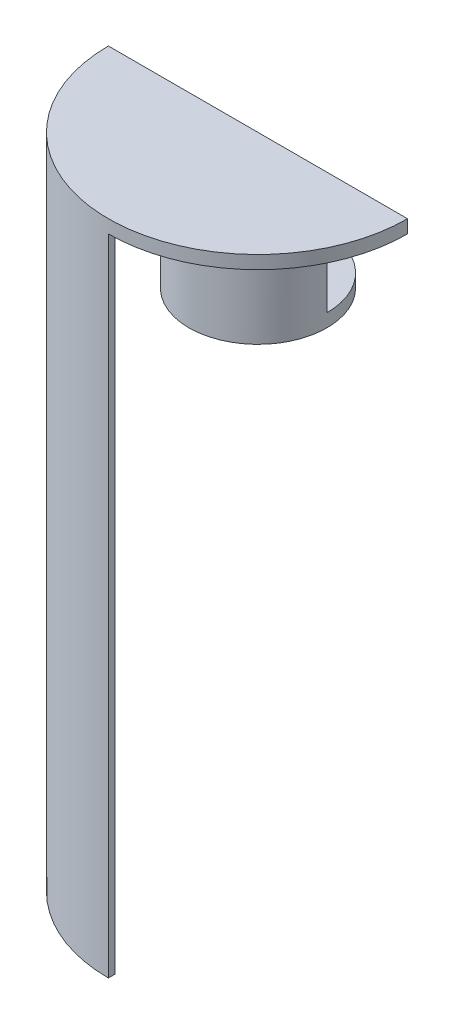
ISO-10303-21;
HEADER;
FILE_DESCRIPTION(('STEP AP214'),'2;1');
FILE_NAME('part.step','',(''),(''),'','','');
FILE_SCHEMA(('AUTOMOTIVE_DESIGN { 1 0 10303 214 1 1 1 1 }'));
ENDSEC;
DATA;
#1=APPLICATION_CONTEXT('core data for automotive mechanical design processes');
#2=APPLICATION_PROTOCOL_DEFINITION('international standard','automotive_design',2000,#1);
#3=PRODUCT_CONTEXT('',#1,'mechanical');
#4=PRODUCT('Part','Part','',(#3));
#5=PRODUCT_RELATED_PRODUCT_CATEGORY('part','',(#4));
#6=PRODUCT_DEFINITION_FORMATION('','',#4);
#7=PRODUCT_DEFINITION_CONTEXT('part definition',#1,'design');
#8=PRODUCT_DEFINITION('design','',#6,#7);
#9=PRODUCT_DEFINITION_SHAPE('','',#8);
#10=(LENGTH_UNIT() NAMED_UNIT(*) SI_UNIT(.MILLI.,.METRE.));
#11=(NAMED_UNIT(*) PLANE_ANGLE_UNIT() SI_UNIT($,.RADIAN.));
#12=(NAMED_UNIT(*) SI_UNIT($,.STERADIAN.) SOLID_ANGLE_UNIT());
#13=UNCERTAINTY_MEASURE_WITH_UNIT(LENGTH_MEASURE(1.E-05),#10,'distance_accuracy_value','');
#14=(GEOMETRIC_REPRESENTATION_CONTEXT(3) GLOBAL_UNCERTAINTY_ASSIGNED_CONTEXT((#13)) GLOBAL_UNIT_ASSIGNED_CONTEXT((#10,
#11,#12)) REPRESENTATION_CONTEXT('',''));
#15=CARTESIAN_POINT('',(0.,0.,0.));
#16=DIRECTION('',(0.,0.,1.));
#17=DIRECTION('',(1.,0.,0.));
#18=AXIS2_PLACEMENT_3D('',#15,#16,#17);
#19=CARTESIAN_POINT('',(0.,200.,0.));
#20=DIRECTION('',(0.,1.,0.));
#21=DIRECTION('',(0.,0.,1.));
#22=AXIS2_PLACEMENT_3D('',#19,#20,#21);
#23=PLANE('',#22);
#24=CARTESIAN_POINT('',(0.,200.,0.));
#25=DIRECTION('',(0.,-1.,0.));
#26=DIRECTION('',(0.,0.,1.));
#27=AXIS2_PLACEMENT_3D('',#24,#25,#26);
#28=CIRCLE('',#27,43.5);
#29=CARTESIAN_POINT('',(0.,200.,43.5));
#30=VERTEX_POINT('',#29);
#31=CARTESIAN_POINT('',(-43.5,200.,0.));
#32=VERTEX_POINT('',#31);
#33=EDGE_CURVE('E145',#30,#32,#28,.T.);
#34=ORIENTED_EDGE('',*,*,#33,.T.);
#35=DIRECTION('',(-1.,0.,0.));
#36=VECTOR('',#35,1.);
#37=CARTESIAN_POINT('',(0.,200.,0.));
#38=LINE('',#37,#36);
#39=CARTESIAN_POINT('',(-21.,200.,0.));
#40=VERTEX_POINT('',#39);
#41=EDGE_CURVE('E233',#40,#32,#38,.T.);
#42=ORIENTED_EDGE('',*,*,#41,.F.);
#43=CARTESIAN_POINT('',(0.,200.,0.));
#44=DIRECTION('',(0.,1.,0.));
#45=DIRECTION('',(0.,0.,1.));
#46=AXIS2_PLACEMENT_3D('',#43,#44,#45);
#47=CIRCLE('',#46,21.);
#48=CARTESIAN_POINT('',(21.,200.,0.));
#49=VERTEX_POINT('',#48);
#50=EDGE_CURVE('E170',#49,#40,#47,.F.);
#51=ORIENTED_EDGE('',*,*,#50,.F.);
#52=CARTESIAN_POINT('',(45.5,200.,0.));
#53=VERTEX_POINT('',#52);
#54=EDGE_CURVE('E152',#53,#49,#38,.T.);
#55=ORIENTED_EDGE('',*,*,#54,.F.);
#56=CARTESIAN_POINT('',(0.,200.,0.));
#57=DIRECTION('',(0.,1.,0.));
#58=DIRECTION('',(0.,0.,1.));
#59=AXIS2_PLACEMENT_3D('',#56,#57,#58);
#60=CIRCLE('',#59,45.5);
#61=CARTESIAN_POINT('',(0.,200.,45.5));
#62=VERTEX_POINT('',#61);
#63=EDGE_CURVE('E156',#62,#53,#60,.T.);
#64=ORIENTED_EDGE('',*,*,#63,.F.);
#65=DIRECTION('',(0.,0.,1.));
#66=VECTOR('',#65,1.);
#67=CARTESIAN_POINT('',(0.,200.,43.5));
#68=LINE('',#67,#66);
#69=EDGE_CURVE('E178',#30,#62,#68,.T.);
#70=ORIENTED_EDGE('',*,*,#69,.F.);
#71=EDGE_LOOP('',(#34,#42,#51,#55,#64,#70));
#72=FACE_BOUND('',#71,.T.);
#73=ADVANCED_FACE('F38',(#72),#23,.F.);
#74=CARTESIAN_POINT('',(0.,200.,0.));
#75=DIRECTION('',(0.,-1.,0.));
#76=DIRECTION('',(0.,0.,-1.));
#77=AXIS2_PLACEMENT_3D('',#74,#75,#76);
#78=CYLINDRICAL_SURFACE('',#77,45.5);
#79=CARTESIAN_POINT('',(0.,204.,0.));
#80=DIRECTION('',(0.,1.,0.));
#81=DIRECTION('',(0.,0.,1.));
#82=AXIS2_PLACEMENT_3D('',#79,#80,#81);
#83=CIRCLE('',#82,45.5);
#84=CARTESIAN_POINT('',(-45.5,204.,0.));
#85=VERTEX_POINT('',#84);
#86=CARTESIAN_POINT('',(45.5,204.,0.));
#87=VERTEX_POINT('',#86);
#88=EDGE_CURVE('E150',#85,#87,#83,.T.);
#89=ORIENTED_EDGE('',*,*,#88,.F.);
#90=DIRECTION('',(0.,-1.,0.));
#91=VECTOR('',#90,1.);
#92=CARTESIAN_POINT('',(-45.5,200.,0.));
#93=LINE('',#92,#91);
#94=CARTESIAN_POINT('',(-45.5,4.,0.));
#95=VERTEX_POINT('',#94);
#96=EDGE_CURVE('E133',#85,#95,#93,.T.);
#97=ORIENTED_EDGE('',*,*,#96,.T.);
#98=CARTESIAN_POINT('',(0.,4.,0.));
#99=DIRECTION('',(0.,-1.,0.));
#100=DIRECTION('',(0.,0.,-1.));
#101=AXIS2_PLACEMENT_3D('',#98,#99,#100);
#102=CIRCLE('',#101,45.5);
#103=CARTESIAN_POINT('',(0.,4.,45.5));
#104=VERTEX_POINT('',#103);
#105=EDGE_CURVE('E174',#104,#95,#102,.T.);
#106=ORIENTED_EDGE('',*,*,#105,.F.);
#107=DIRECTION('',(0.,-1.,0.));
#108=VECTOR('',#107,1.);
#109=CARTESIAN_POINT('',(0.,264.346717087976,45.5));
#110=LINE('',#109,#108);
#111=EDGE_CURVE('E60',#62,#104,#110,.T.);
#112=ORIENTED_EDGE('',*,*,#111,.F.);
#113=ORIENTED_EDGE('',*,*,#63,.T.);
#114=DIRECTION('',(0.,-1.,0.));
#115=VECTOR('',#114,1.);
#116=CARTESIAN_POINT('',(45.5,305.74109297624,0.));
#117=LINE('',#116,#115);
#118=EDGE_CURVE('E151',#87,#53,#117,.T.);
#119=ORIENTED_EDGE('',*,*,#118,.F.);
#120=EDGE_LOOP('',(#89,#97,#106,#112,#113,#119));
#121=FACE_BOUND('',#120,.T.);
#122=ADVANCED_FACE('F154',(#121),#78,.T.);
#123=CARTESIAN_POINT('',(0.,200.,0.));
#124=DIRECTION('',(0.,-1.,0.));
#125=DIRECTION('',(0.,0.,-1.));
#126=AXIS2_PLACEMENT_3D('',#123,#124,#125);
#127=CYLINDRICAL_SURFACE('',#126,43.5);
#128=DIRECTION('',(0.,-1.,0.));
#129=VECTOR('',#128,1.);
#130=CARTESIAN_POINT('',(0.,264.346717087976,43.5));
#131=LINE('',#130,#129);
#132=CARTESIAN_POINT('',(0.,4.,43.5));
#133=VERTEX_POINT('',#132);
#134=EDGE_CURVE('E243',#30,#133,#131,.T.);
#135=ORIENTED_EDGE('',*,*,#134,.T.);
#136=CARTESIAN_POINT('',(0.,4.,0.));
#137=DIRECTION('',(0.,1.,0.));
#138=DIRECTION('',(0.,0.,1.));
#139=AXIS2_PLACEMENT_3D('',#136,#137,#138);
#140=CIRCLE('',#139,43.5);
#141=CARTESIAN_POINT('',(-43.5,4.,0.));
#142=VERTEX_POINT('',#141);
#143=EDGE_CURVE('E167',#142,#133,#140,.T.);
#144=ORIENTED_EDGE('',*,*,#143,.F.);
#145=DIRECTION('',(0.,-1.,0.));
#146=VECTOR('',#145,1.);
#147=CARTESIAN_POINT('',(-43.5,200.,0.));
#148=LINE('',#147,#146);
#149=EDGE_CURVE('E144',#32,#142,#148,.T.);
#150=ORIENTED_EDGE('',*,*,#149,.F.);
#151=ORIENTED_EDGE('',*,*,#33,.F.);
#152=EDGE_LOOP('',(#135,#144,#150,#151));
#153=FACE_BOUND('',#152,.T.);
#154=ADVANCED_FACE('F40',(#153),#127,.F.);
#155=CARTESIAN_POINT('',(0.,4.,0.));
#156=DIRECTION('',(0.,-1.,0.));
#157=DIRECTION('',(0.,0.,-1.));
#158=AXIS2_PLACEMENT_3D('',#155,#156,#157);
#159=PLANE('',#158);
#160=ORIENTED_EDGE('',*,*,#143,.T.);
#161=DIRECTION('',(0.,0.,1.));
#162=VECTOR('',#161,1.);
#163=CARTESIAN_POINT('',(0.,4.,0.));
#164=LINE('',#163,#162);
#165=EDGE_CURVE('E46',#133,#104,#164,.T.);
#166=ORIENTED_EDGE('',*,*,#165,.T.);
#167=ORIENTED_EDGE('',*,*,#105,.T.);
#168=DIRECTION('',(1.,0.,0.));
#169=VECTOR('',#168,1.);
#170=CARTESIAN_POINT('',(-45.5,4.,0.));
#171=LINE('',#170,#169);
#172=EDGE_CURVE('E140',#95,#142,#171,.T.);
#173=ORIENTED_EDGE('',*,*,#172,.T.);
#174=EDGE_LOOP('',(#160,#166,#167,#173));
#175=FACE_BOUND('',#174,.T.);
#176=ADVANCED_FACE('F173',(#175),#159,.T.);
#177=CARTESIAN_POINT('',(0.,200.,0.));
#178=DIRECTION('',(0.,-1.,0.));
#179=DIRECTION('',(0.,0.,-1.));
#180=AXIS2_PLACEMENT_3D('',#177,#178,#179);
#181=CIRCLE('',#180,19.);
#182=CARTESIAN_POINT('',(19.,200.,0.));
#183=VERTEX_POINT('',#182);
#184=CARTESIAN_POINT('',(-19.,200.,0.));
#185=VERTEX_POINT('',#184);
#186=EDGE_CURVE('E163',#183,#185,#181,.T.);
#187=ORIENTED_EDGE('',*,*,#186,.T.);
#188=EDGE_CURVE('E229',#183,#185,#38,.T.);
#189=ORIENTED_EDGE('',*,*,#188,.F.);
#190=EDGE_LOOP('',(#187,#189));
#191=FACE_BOUND('',#190,.T.);
#192=ADVANCED_FACE('F228',(#191),#23,.F.);
#193=CARTESIAN_POINT('',(0.,204.,0.));
#194=DIRECTION('',(0.,1.,0.));
#195=DIRECTION('',(0.,0.,1.));
#196=AXIS2_PLACEMENT_3D('',#193,#194,#195);
#197=PLANE('',#196);
#198=DIRECTION('',(-1.,0.,0.));
#199=VECTOR('',#198,1.);
#200=CARTESIAN_POINT('',(0.,204.,0.));
#201=LINE('',#200,#199);
#202=EDGE_CURVE('E137',#87,#85,#201,.T.);
#203=ORIENTED_EDGE('',*,*,#202,.T.);
#204=ORIENTED_EDGE('',*,*,#88,.T.);
#205=EDGE_LOOP('',(#203,#204));
#206=FACE_BOUND('',#205,.T.);
#207=ADVANCED_FACE('F149',(#206),#197,.T.);
#208=CARTESIAN_POINT('',(0.,167.,0.));
#209=DIRECTION('',(0.,1.,0.));
#210=DIRECTION('',(0.,0.,1.));
#211=AXIS2_PLACEMENT_3D('',#208,#209,#210);
#212=CYLINDRICAL_SURFACE('',#211,21.);
#213=CARTESIAN_POINT('',(0.,163.,0.));
#214=DIRECTION('',(0.,-1.,0.));
#215=DIRECTION('',(0.,0.,-1.));
#216=AXIS2_PLACEMENT_3D('',#213,#214,#215);
#217=CIRCLE('',#216,21.);
#218=CARTESIAN_POINT('',(3.00000000000001,163.,-20.7846096908265));
#219=VERTEX_POINT('',#218);
#220=CARTESIAN_POINT('',(-3.,163.,-20.7846096908265));
#221=VERTEX_POINT('',#220);
#222=EDGE_CURVE('E201',#219,#221,#217,.T.);
#223=ORIENTED_EDGE('',*,*,#222,.F.);
#224=DIRECTION('',(0.,-1.,0.));
#225=VECTOR('',#224,1.);
#226=CARTESIAN_POINT('',(3.00000000000001,167.,-20.7846096908265));
#227=LINE('',#226,#225);
#228=CARTESIAN_POINT('',(3.00000000000001,167.,-20.7846096908265));
#229=VERTEX_POINT('',#228);
#230=EDGE_CURVE('E196',#229,#219,#227,.T.);
#231=ORIENTED_EDGE('',*,*,#230,.F.);
#232=CARTESIAN_POINT('',(0.,167.,0.));
#233=DIRECTION('',(0.,-1.,0.));
#234=DIRECTION('',(0.,0.,-1.));
#235=AXIS2_PLACEMENT_3D('',#232,#233,#234);
#236=CIRCLE('',#235,21.);
#237=CARTESIAN_POINT('',(21.,167.,0.));
#238=VERTEX_POINT('',#237);
#239=EDGE_CURVE('E198',#229,#238,#236,.T.);
#240=ORIENTED_EDGE('',*,*,#239,.T.);
#241=DIRECTION('',(0.,-1.,0.));
#242=VECTOR('',#241,1.);
#243=CARTESIAN_POINT('',(21.,200.,0.));
#244=LINE('',#243,#242);
#245=EDGE_CURVE('E211',#49,#238,#244,.T.);
#246=ORIENTED_EDGE('',*,*,#245,.F.);
#247=ORIENTED_EDGE('',*,*,#50,.T.);
#248=DIRECTION('',(0.,-1.,0.));
#249=VECTOR('',#248,1.);
#250=CARTESIAN_POINT('',(-21.,200.,0.));
#251=LINE('',#250,#249);
#252=CARTESIAN_POINT('',(-21.,167.,0.));
#253=VERTEX_POINT('',#252);
#254=EDGE_CURVE('E212',#40,#253,#251,.T.);
#255=ORIENTED_EDGE('',*,*,#254,.T.);
#256=CARTESIAN_POINT('',(-3.,167.,-20.7846096908265));
#257=VERTEX_POINT('',#256);
#258=EDGE_CURVE('E205',#253,#257,#236,.T.);
#259=ORIENTED_EDGE('',*,*,#258,.T.);
#260=DIRECTION('',(0.,-1.,0.));
#261=VECTOR('',#260,1.);
#262=CARTESIAN_POINT('',(-3.,167.,-20.7846096908265));
#263=LINE('',#262,#261);
#264=EDGE_CURVE('E192',#257,#221,#263,.T.);
#265=ORIENTED_EDGE('',*,*,#264,.T.);
#266=EDGE_LOOP('',(#223,#231,#240,#246,#247,#255,#259,#265));
#267=FACE_BOUND('',#266,.T.);
#268=ADVANCED_FACE('F254',(#267),#212,.T.);
#269=CARTESIAN_POINT('',(0.,167.,0.));
#270=DIRECTION('',(0.,1.,0.));
#271=DIRECTION('',(0.,0.,1.));
#272=AXIS2_PLACEMENT_3D('',#269,#270,#271);
#273=CYLINDRICAL_SURFACE('',#272,19.);
#274=DIRECTION('',(0.,1.,0.));
#275=VECTOR('',#274,1.);
#276=CARTESIAN_POINT('',(19.,167.,0.));
#277=LINE('',#276,#275);
#278=CARTESIAN_POINT('',(19.,167.,0.));
#279=VERTEX_POINT('',#278);
#280=EDGE_CURVE('E220',#279,#183,#277,.T.);
#281=ORIENTED_EDGE('',*,*,#280,.F.);
#282=CARTESIAN_POINT('',(0.,167.,0.));
#283=DIRECTION('',(0.,-1.,0.));
#284=DIRECTION('',(0.,0.,-1.));
#285=AXIS2_PLACEMENT_3D('',#282,#283,#284);
#286=CIRCLE('',#285,19.);
#287=CARTESIAN_POINT('',(-19.,167.,0.));
#288=VERTEX_POINT('',#287);
#289=EDGE_CURVE('E160',#279,#288,#286,.T.);
#290=ORIENTED_EDGE('',*,*,#289,.T.);
#291=DIRECTION('',(0.,1.,0.));
#292=VECTOR('',#291,1.);
#293=CARTESIAN_POINT('',(-19.,167.,0.));
#294=LINE('',#293,#292);
#295=EDGE_CURVE('E215',#185,#288,#294,.F.);
#296=ORIENTED_EDGE('',*,*,#295,.F.);
#297=ORIENTED_EDGE('',*,*,#186,.F.);
#298=EDGE_LOOP('',(#281,#290,#296,#297));
#299=FACE_BOUND('',#298,.T.);
#300=ADVANCED_FACE('F230',(#299),#273,.F.);
#301=CARTESIAN_POINT('',(21.,200.,0.));
#302=DIRECTION('',(0.,0.,1.));
#303=DIRECTION('',(1.,0.,0.));
#304=AXIS2_PLACEMENT_3D('',#301,#302,#303);
#305=PLANE('',#304);
#306=ORIENTED_EDGE('',*,*,#280,.T.);
#307=ORIENTED_EDGE('',*,*,#188,.T.);
#308=ORIENTED_EDGE('',*,*,#295,.T.);
#309=DIRECTION('',(-1.,0.,0.));
#310=VECTOR('',#309,1.);
#311=CARTESIAN_POINT('',(21.,167.,0.));
#312=LINE('',#311,#310);
#313=EDGE_CURVE('E204',#288,#253,#312,.T.);
#314=ORIENTED_EDGE('',*,*,#313,.T.);
#315=ORIENTED_EDGE('',*,*,#254,.F.);
#316=ORIENTED_EDGE('',*,*,#41,.T.);
#317=ORIENTED_EDGE('',*,*,#149,.T.);
#318=ORIENTED_EDGE('',*,*,#172,.F.);
#319=ORIENTED_EDGE('',*,*,#96,.F.);
#320=ORIENTED_EDGE('',*,*,#202,.F.);
#321=ORIENTED_EDGE('',*,*,#118,.T.);
#322=ORIENTED_EDGE('',*,*,#54,.T.);
#323=ORIENTED_EDGE('',*,*,#245,.T.);
#324=EDGE_CURVE('E208',#238,#279,#312,.T.);
#325=ORIENTED_EDGE('',*,*,#324,.T.);
#326=EDGE_LOOP('',(#306,#307,#308,#314,#315,#316,#317,#318,#319,#320,#321,#322,#323,#325));
#327=FACE_BOUND('',#326,.T.);
#328=ADVANCED_FACE('F136',(#327),#305,.F.);
#329=CARTESIAN_POINT('',(0.,167.,0.));
#330=DIRECTION('',(0.,-1.,0.));
#331=DIRECTION('',(0.,0.,-1.));
#332=AXIS2_PLACEMENT_3D('',#329,#330,#331);
#333=PLANE('',#332);
#334=DIRECTION('',(0.,0.,1.));
#335=VECTOR('',#334,1.);
#336=CARTESIAN_POINT('',(3.,167.,0.));
#337=LINE('',#336,#335);
#338=CARTESIAN_POINT('',(3.,167.,-9.53939201416946));
#339=VERTEX_POINT('',#338);
#340=EDGE_CURVE('E188',#229,#339,#337,.T.);
#341=ORIENTED_EDGE('',*,*,#340,.T.);
#342=CARTESIAN_POINT('',(0.,167.,0.));
#343=DIRECTION('',(0.,-1.,0.));
#344=DIRECTION('',(0.,0.,-1.));
#345=AXIS2_PLACEMENT_3D('',#342,#343,#344);
#346=CIRCLE('',#345,10.);
#347=CARTESIAN_POINT('',(-3.,167.,-9.53939201416946));
#348=VERTEX_POINT('',#347);
#349=EDGE_CURVE('E237',#339,#348,#346,.T.);
#350=ORIENTED_EDGE('',*,*,#349,.T.);
#351=DIRECTION('',(0.,0.,-1.));
#352=VECTOR('',#351,1.);
#353=CARTESIAN_POINT('',(-3.,167.,0.));
#354=LINE('',#353,#352);
#355=EDGE_CURVE('E186',#348,#257,#354,.T.);
#356=ORIENTED_EDGE('',*,*,#355,.T.);
#357=ORIENTED_EDGE('',*,*,#258,.F.);
#358=ORIENTED_EDGE('',*,*,#313,.F.);
#359=ORIENTED_EDGE('',*,*,#289,.F.);
#360=ORIENTED_EDGE('',*,*,#324,.F.);
#361=ORIENTED_EDGE('',*,*,#239,.F.);
#362=EDGE_LOOP('',(#341,#350,#356,#357,#358,#359,#360,#361));
#363=FACE_BOUND('',#362,.T.);
#364=ADVANCED_FACE('F259',(#363),#333,.F.);
#365=CARTESIAN_POINT('',(0.,163.,0.));
#366=DIRECTION('',(0.,-1.,0.));
#367=DIRECTION('',(0.,0.,-1.));
#368=AXIS2_PLACEMENT_3D('',#365,#366,#367);
#369=PLANE('',#368);
#370=CARTESIAN_POINT('',(0.,163.,0.));
#371=DIRECTION('',(0.,-1.,0.));
#372=DIRECTION('',(0.,0.,-1.));
#373=AXIS2_PLACEMENT_3D('',#370,#371,#372);
#374=CIRCLE('',#373,10.);
#375=CARTESIAN_POINT('',(3.,163.,-9.53939201416946));
#376=VERTEX_POINT('',#375);
#377=CARTESIAN_POINT('',(-3.,163.,-9.53939201416946));
#378=VERTEX_POINT('',#377);
#379=EDGE_CURVE('E53',#376,#378,#374,.T.);
#380=ORIENTED_EDGE('',*,*,#379,.F.);
#381=DIRECTION('',(0.,0.,1.));
#382=VECTOR('',#381,1.);
#383=CARTESIAN_POINT('',(3.,163.,0.));
#384=LINE('',#383,#382);
#385=EDGE_CURVE('E189',#219,#376,#384,.T.);
#386=ORIENTED_EDGE('',*,*,#385,.F.);
#387=ORIENTED_EDGE('',*,*,#222,.T.);
#388=DIRECTION('',(0.,0.,-1.));
#389=VECTOR('',#388,1.);
#390=CARTESIAN_POINT('',(-3.,163.,0.));
#391=LINE('',#390,#389);
#392=EDGE_CURVE('E180',#378,#221,#391,.T.);
#393=ORIENTED_EDGE('',*,*,#392,.F.);
#394=EDGE_LOOP('',(#380,#386,#387,#393));
#395=FACE_BOUND('',#394,.T.);
#396=ADVANCED_FACE('F266',(#395),#369,.T.);
#397=CARTESIAN_POINT('',(3.,167.,0.));
#398=DIRECTION('',(1.,0.,0.));
#399=DIRECTION('',(0.,0.,-1.));
#400=AXIS2_PLACEMENT_3D('',#397,#398,#399);
#401=PLANE('',#400);
#402=ORIENTED_EDGE('',*,*,#385,.T.);
#403=DIRECTION('',(0.,-1.,0.));
#404=VECTOR('',#403,1.);
#405=CARTESIAN_POINT('',(3.,167.,-9.53939201416946));
#406=LINE('',#405,#404);
#407=EDGE_CURVE('E240',#376,#339,#406,.F.);
#408=ORIENTED_EDGE('',*,*,#407,.T.);
#409=ORIENTED_EDGE('',*,*,#340,.F.);
#410=ORIENTED_EDGE('',*,*,#230,.T.);
#411=EDGE_LOOP('',(#402,#408,#409,#410));
#412=FACE_BOUND('',#411,.T.);
#413=ADVANCED_FACE('F268',(#412),#401,.F.);
#414=CARTESIAN_POINT('',(-3.,167.,0.));
#415=DIRECTION('',(-1.,0.,0.));
#416=DIRECTION('',(0.,0.,1.));
#417=AXIS2_PLACEMENT_3D('',#414,#415,#416);
#418=PLANE('',#417);
#419=ORIENTED_EDGE('',*,*,#355,.F.);
#420=DIRECTION('',(0.,-1.,0.));
#421=VECTOR('',#420,1.);
#422=CARTESIAN_POINT('',(-3.,167.,-9.53939201416946));
#423=LINE('',#422,#421);
#424=EDGE_CURVE('E11',#348,#378,#423,.T.);
#425=ORIENTED_EDGE('',*,*,#424,.T.);
#426=ORIENTED_EDGE('',*,*,#392,.T.);
#427=ORIENTED_EDGE('',*,*,#264,.F.);
#428=EDGE_LOOP('',(#419,#425,#426,#427));
#429=FACE_BOUND('',#428,.T.);
#430=ADVANCED_FACE('F269',(#429),#418,.F.);
#431=CARTESIAN_POINT('',(0.,264.346717087976,43.5));
#432=DIRECTION('',(1.,0.,0.));
#433=DIRECTION('',(0.,0.,-1.));
#434=AXIS2_PLACEMENT_3D('',#431,#432,#433);
#435=PLANE('',#434);
#436=ORIENTED_EDGE('',*,*,#134,.F.);
#437=ORIENTED_EDGE('',*,*,#69,.T.);
#438=ORIENTED_EDGE('',*,*,#111,.T.);
#439=ORIENTED_EDGE('',*,*,#165,.F.);
#440=EDGE_LOOP('',(#436,#437,#438,#439));
#441=FACE_BOUND('',#440,.T.);
#442=ADVANCED_FACE('F247',(#441),#435,.T.);
#443=CARTESIAN_POINT('',(0.,167.,0.));
#444=DIRECTION('',(0.,-1.,0.));
#445=DIRECTION('',(0.,0.,-1.));
#446=AXIS2_PLACEMENT_3D('',#443,#444,#445);
#447=CYLINDRICAL_SURFACE('',#446,10.);
#448=ORIENTED_EDGE('',*,*,#379,.T.);
#449=ORIENTED_EDGE('',*,*,#424,.F.);
#450=ORIENTED_EDGE('',*,*,#349,.F.);
#451=ORIENTED_EDGE('',*,*,#407,.F.);
#452=EDGE_LOOP('',(#448,#449,#450,#451));
#453=FACE_BOUND('',#452,.T.);
#454=ADVANCED_FACE('F270',(#453),#447,.F.);
#455=CLOSED_SHELL('',(#73,#122,#154,#176,#192,#207,#268,#300,#328,#364,#396,#413,#430,#442,#454));
#456=MANIFOLD_SOLID_BREP('B2',#455);
#457=ADVANCED_BREP_SHAPE_REPRESENTATION('',(#18,#456),#14);
#458=SHAPE_DEFINITION_REPRESENTATION(#9,#457);
ENDSEC;
END-ISO-10303-21;
